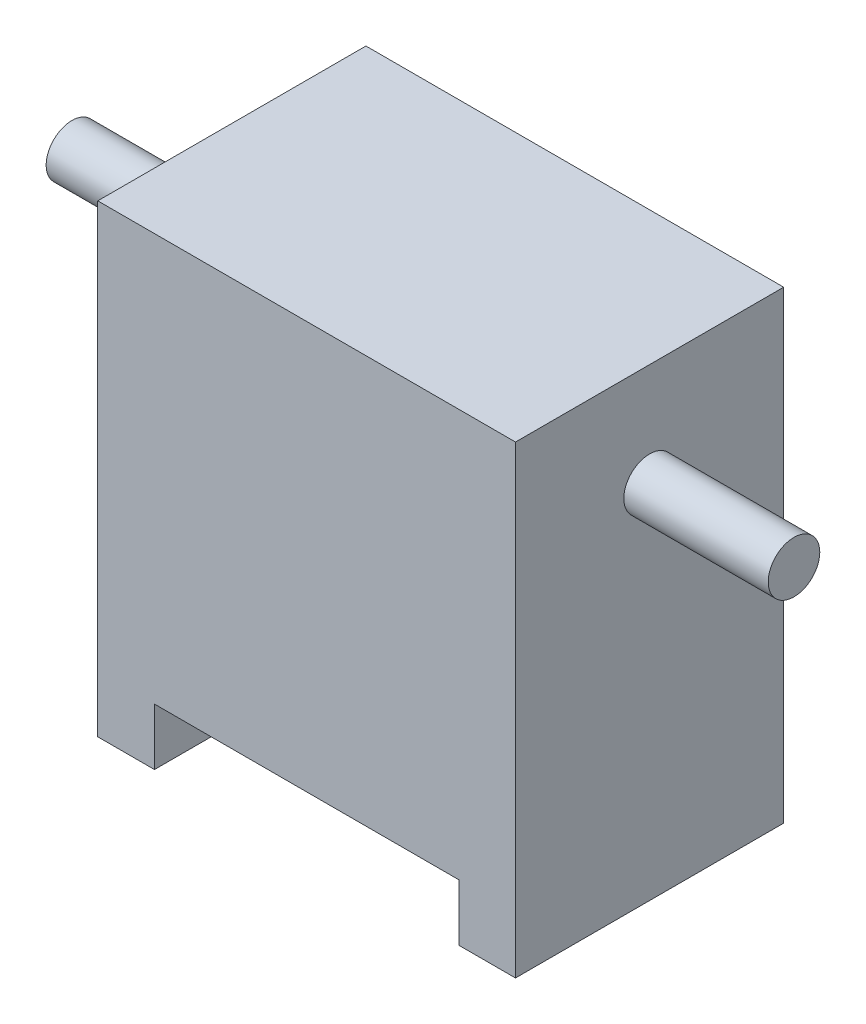
ISO-10303-21;
HEADER;
FILE_DESCRIPTION(('STEP AP214'),'2;1');
FILE_NAME('part.step','',(''),(''),'','','');
FILE_SCHEMA(('AUTOMOTIVE_DESIGN { 1 0 10303 214 1 1 1 1 }'));
ENDSEC;
DATA;
#1=APPLICATION_CONTEXT('core data for automotive mechanical design processes');
#2=APPLICATION_PROTOCOL_DEFINITION('international standard','automotive_design',2000,#1);
#3=PRODUCT_CONTEXT('',#1,'mechanical');
#4=PRODUCT('Part','Part','',(#3));
#5=PRODUCT_RELATED_PRODUCT_CATEGORY('part','',(#4));
#6=PRODUCT_DEFINITION_FORMATION('','',#4);
#7=PRODUCT_DEFINITION_CONTEXT('part definition',#1,'design');
#8=PRODUCT_DEFINITION('design','',#6,#7);
#9=PRODUCT_DEFINITION_SHAPE('','',#8);
#10=(LENGTH_UNIT() NAMED_UNIT(*) SI_UNIT(.MILLI.,.METRE.));
#11=(NAMED_UNIT(*) PLANE_ANGLE_UNIT() SI_UNIT($,.RADIAN.));
#12=(NAMED_UNIT(*) SI_UNIT($,.STERADIAN.) SOLID_ANGLE_UNIT());
#13=UNCERTAINTY_MEASURE_WITH_UNIT(LENGTH_MEASURE(1.E-05),#10,'distance_accuracy_value','');
#14=(GEOMETRIC_REPRESENTATION_CONTEXT(3) GLOBAL_UNCERTAINTY_ASSIGNED_CONTEXT((#13)) GLOBAL_UNIT_ASSIGNED_CONTEXT((#10,
#11,#12)) REPRESENTATION_CONTEXT('',''));
#15=CARTESIAN_POINT('',(0.,0.,0.));
#16=DIRECTION('',(0.,0.,1.));
#17=DIRECTION('',(1.,0.,0.));
#18=AXIS2_PLACEMENT_3D('',#15,#16,#17);
#19=CARTESIAN_POINT('',(0.,-45.,26.));
#20=DIRECTION('',(0.,1.,0.));
#21=DIRECTION('',(0.,0.,1.));
#22=AXIS2_PLACEMENT_3D('',#19,#20,#21);
#23=PLANE('',#22);
#24=DIRECTION('',(1.,0.,0.));
#25=VECTOR('',#24,1.);
#26=CARTESIAN_POINT('',(0.,-45.,26.));
#27=LINE('',#26,#25);
#28=CARTESIAN_POINT('',(35.,-45.,26.));
#29=VERTEX_POINT('',#28);
#30=CARTESIAN_POINT('',(40.5,-45.,26.));
#31=VERTEX_POINT('',#30);
#32=EDGE_CURVE('E153',#29,#31,#27,.T.);
#33=ORIENTED_EDGE('',*,*,#32,.F.);
#34=DIRECTION('',(0.,0.,1.));
#35=VECTOR('',#34,1.);
#36=CARTESIAN_POINT('',(35.,-45.,-12.));
#37=LINE('',#36,#35);
#38=CARTESIAN_POINT('',(35.,-45.,0.));
#39=VERTEX_POINT('',#38);
#40=EDGE_CURVE('E145',#39,#29,#37,.T.);
#41=ORIENTED_EDGE('',*,*,#40,.F.);
#42=DIRECTION('',(1.,0.,0.));
#43=VECTOR('',#42,1.);
#44=CARTESIAN_POINT('',(0.,-45.,0.));
#45=LINE('',#44,#43);
#46=CARTESIAN_POINT('',(40.5,-45.,0.));
#47=VERTEX_POINT('',#46);
#48=EDGE_CURVE('E165',#39,#47,#45,.T.);
#49=ORIENTED_EDGE('',*,*,#48,.T.);
#50=DIRECTION('',(0.,0.,-1.));
#51=VECTOR('',#50,1.);
#52=CARTESIAN_POINT('',(40.5,-45.,26.));
#53=LINE('',#52,#51);
#54=EDGE_CURVE('E180',#31,#47,#53,.T.);
#55=ORIENTED_EDGE('',*,*,#54,.F.);
#56=EDGE_LOOP('',(#33,#41,#49,#55));
#57=FACE_BOUND('',#56,.T.);
#58=ADVANCED_FACE('F39',(#57),#23,.F.);
#59=CARTESIAN_POINT('',(0.,0.,26.));
#60=DIRECTION('',(1.,0.,0.));
#61=DIRECTION('',(0.,1.,0.));
#62=AXIS2_PLACEMENT_3D('',#59,#60,#61);
#63=PLANE('',#62);
#64=CARTESIAN_POINT('',(0.,-10.,13.));
#65=DIRECTION('',(1.,0.,0.));
#66=DIRECTION('',(0.,1.,0.));
#67=AXIS2_PLACEMENT_3D('',#64,#65,#66);
#68=CIRCLE('',#67,2.5);
#69=CARTESIAN_POINT('',(0.,-7.5,13.));
#70=VERTEX_POINT('',#69);
#71=EDGE_CURVE('E133',#70,#70,#68,.T.);
#72=ORIENTED_EDGE('',*,*,#71,.T.);
#73=EDGE_LOOP('',(#72));
#74=FACE_BOUND('',#73,.T.);
#75=DIRECTION('',(0.,-1.,0.));
#76=VECTOR('',#75,1.);
#77=CARTESIAN_POINT('',(0.,0.,0.));
#78=LINE('',#77,#76);
#79=CARTESIAN_POINT('',(0.,0.,0.));
#80=VERTEX_POINT('',#79);
#81=CARTESIAN_POINT('',(0.,-45.,0.));
#82=VERTEX_POINT('',#81);
#83=EDGE_CURVE('E144',#80,#82,#78,.T.);
#84=ORIENTED_EDGE('',*,*,#83,.T.);
#85=DIRECTION('',(0.,0.,-1.));
#86=VECTOR('',#85,1.);
#87=CARTESIAN_POINT('',(0.,-45.,26.));
#88=LINE('',#87,#86);
#89=CARTESIAN_POINT('',(0.,-45.,26.));
#90=VERTEX_POINT('',#89);
#91=EDGE_CURVE('E184',#90,#82,#88,.T.);
#92=ORIENTED_EDGE('',*,*,#91,.F.);
#93=DIRECTION('',(0.,-1.,0.));
#94=VECTOR('',#93,1.);
#95=CARTESIAN_POINT('',(0.,0.,26.));
#96=LINE('',#95,#94);
#97=CARTESIAN_POINT('',(0.,0.,26.));
#98=VERTEX_POINT('',#97);
#99=EDGE_CURVE('E150',#98,#90,#96,.T.);
#100=ORIENTED_EDGE('',*,*,#99,.F.);
#101=DIRECTION('',(0.,0.,-1.));
#102=VECTOR('',#101,1.);
#103=CARTESIAN_POINT('',(0.,0.,26.));
#104=LINE('',#103,#102);
#105=EDGE_CURVE('E161',#98,#80,#104,.T.);
#106=ORIENTED_EDGE('',*,*,#105,.T.);
#107=EDGE_LOOP('',(#84,#92,#100,#106));
#108=FACE_BOUND('',#107,.T.);
#109=ADVANCED_FACE('F41',(#74,#108),#63,.F.);
#110=CARTESIAN_POINT('',(5.50000000000001,-45.,0.));
#111=VERTEX_POINT('',#110);
#112=EDGE_CURVE('E166',#82,#111,#45,.T.);
#113=ORIENTED_EDGE('',*,*,#112,.T.);
#114=DIRECTION('',(0.,0.,1.));
#115=VECTOR('',#114,1.);
#116=CARTESIAN_POINT('',(5.50000000000001,-45.,-12.));
#117=LINE('',#116,#115);
#118=CARTESIAN_POINT('',(5.50000000000001,-45.,26.));
#119=VERTEX_POINT('',#118);
#120=EDGE_CURVE('E56',#111,#119,#117,.T.);
#121=ORIENTED_EDGE('',*,*,#120,.T.);
#122=EDGE_CURVE('E93',#90,#119,#27,.T.);
#123=ORIENTED_EDGE('',*,*,#122,.F.);
#124=ORIENTED_EDGE('',*,*,#91,.T.);
#125=EDGE_LOOP('',(#113,#121,#123,#124));
#126=FACE_BOUND('',#125,.T.);
#127=ADVANCED_FACE('F218',(#126),#23,.F.);
#128=CARTESIAN_POINT('',(40.5,0.,26.));
#129=DIRECTION('',(-1.,0.,0.));
#130=DIRECTION('',(0.,0.,1.));
#131=AXIS2_PLACEMENT_3D('',#128,#129,#130);
#132=PLANE('',#131);
#133=CARTESIAN_POINT('',(40.5,-10.,13.));
#134=DIRECTION('',(-1.,0.,0.));
#135=DIRECTION('',(0.,0.,1.));
#136=AXIS2_PLACEMENT_3D('',#133,#134,#135);
#137=CIRCLE('',#136,2.5);
#138=CARTESIAN_POINT('',(40.5,-10.,15.5));
#139=VERTEX_POINT('',#138);
#140=EDGE_CURVE('E43',#139,#139,#137,.T.);
#141=ORIENTED_EDGE('',*,*,#140,.T.);
#142=EDGE_LOOP('',(#141));
#143=FACE_BOUND('',#142,.T.);
#144=DIRECTION('',(0.,1.,0.));
#145=VECTOR('',#144,1.);
#146=CARTESIAN_POINT('',(40.5,0.,0.));
#147=LINE('',#146,#145);
#148=CARTESIAN_POINT('',(40.5,0.,0.));
#149=VERTEX_POINT('',#148);
#150=EDGE_CURVE('E170',#47,#149,#147,.T.);
#151=ORIENTED_EDGE('',*,*,#150,.T.);
#152=DIRECTION('',(0.,0.,-1.));
#153=VECTOR('',#152,1.);
#154=CARTESIAN_POINT('',(40.5,0.,26.));
#155=LINE('',#154,#153);
#156=CARTESIAN_POINT('',(40.5,0.,26.));
#157=VERTEX_POINT('',#156);
#158=EDGE_CURVE('E177',#157,#149,#155,.T.);
#159=ORIENTED_EDGE('',*,*,#158,.F.);
#160=DIRECTION('',(0.,1.,0.));
#161=VECTOR('',#160,1.);
#162=CARTESIAN_POINT('',(40.5,0.,26.));
#163=LINE('',#162,#161);
#164=EDGE_CURVE('E156',#31,#157,#163,.T.);
#165=ORIENTED_EDGE('',*,*,#164,.F.);
#166=ORIENTED_EDGE('',*,*,#54,.T.);
#167=EDGE_LOOP('',(#151,#159,#165,#166));
#168=FACE_BOUND('',#167,.T.);
#169=ADVANCED_FACE('F204',(#143,#168),#132,.F.);
#170=CARTESIAN_POINT('',(0.,0.,26.));
#171=DIRECTION('',(0.,-1.,0.));
#172=DIRECTION('',(0.,0.,-1.));
#173=AXIS2_PLACEMENT_3D('',#170,#171,#172);
#174=PLANE('',#173);
#175=DIRECTION('',(-1.,0.,0.));
#176=VECTOR('',#175,1.);
#177=CARTESIAN_POINT('',(0.,0.,0.));
#178=LINE('',#177,#176);
#179=EDGE_CURVE('E86',#149,#80,#178,.T.);
#180=ORIENTED_EDGE('',*,*,#179,.T.);
#181=ORIENTED_EDGE('',*,*,#105,.F.);
#182=DIRECTION('',(-1.,0.,0.));
#183=VECTOR('',#182,1.);
#184=CARTESIAN_POINT('',(0.,0.,26.));
#185=LINE('',#184,#183);
#186=EDGE_CURVE('E65',#157,#98,#185,.T.);
#187=ORIENTED_EDGE('',*,*,#186,.F.);
#188=ORIENTED_EDGE('',*,*,#158,.T.);
#189=EDGE_LOOP('',(#180,#181,#187,#188));
#190=FACE_BOUND('',#189,.T.);
#191=ADVANCED_FACE('F210',(#190),#174,.F.);
#192=CARTESIAN_POINT('',(0.,0.,26.));
#193=DIRECTION('',(0.,0.,1.));
#194=DIRECTION('',(1.,0.,0.));
#195=AXIS2_PLACEMENT_3D('',#192,#193,#194);
#196=PLANE('',#195);
#197=DIRECTION('',(0.,1.,0.));
#198=VECTOR('',#197,1.);
#199=CARTESIAN_POINT('',(35.,-39.5,26.));
#200=LINE('',#199,#198);
#201=CARTESIAN_POINT('',(35.,-39.5,26.));
#202=VERTEX_POINT('',#201);
#203=EDGE_CURVE('E123',#29,#202,#200,.T.);
#204=ORIENTED_EDGE('',*,*,#203,.F.);
#205=ORIENTED_EDGE('',*,*,#32,.T.);
#206=ORIENTED_EDGE('',*,*,#164,.T.);
#207=ORIENTED_EDGE('',*,*,#186,.T.);
#208=ORIENTED_EDGE('',*,*,#99,.T.);
#209=ORIENTED_EDGE('',*,*,#122,.T.);
#210=DIRECTION('',(0.,-1.,0.));
#211=VECTOR('',#210,1.);
#212=CARTESIAN_POINT('',(5.50000000000001,-39.5,26.));
#213=LINE('',#212,#211);
#214=CARTESIAN_POINT('',(5.50000000000001,-39.5,26.));
#215=VERTEX_POINT('',#214);
#216=EDGE_CURVE('E118',#215,#119,#213,.T.);
#217=ORIENTED_EDGE('',*,*,#216,.F.);
#218=DIRECTION('',(-1.,0.,0.));
#219=VECTOR('',#218,1.);
#220=CARTESIAN_POINT('',(5.50000000000001,-39.5,26.));
#221=LINE('',#220,#219);
#222=EDGE_CURVE('E126',#202,#215,#221,.T.);
#223=ORIENTED_EDGE('',*,*,#222,.F.);
#224=EDGE_LOOP('',(#204,#205,#206,#207,#208,#209,#217,#223));
#225=FACE_BOUND('',#224,.T.);
#226=ADVANCED_FACE('F135',(#225),#196,.T.);
#227=CARTESIAN_POINT('',(0.,0.,0.));
#228=DIRECTION('',(0.,0.,1.));
#229=DIRECTION('',(1.,0.,0.));
#230=AXIS2_PLACEMENT_3D('',#227,#228,#229);
#231=PLANE('',#230);
#232=ORIENTED_EDGE('',*,*,#48,.F.);
#233=DIRECTION('',(0.,1.,0.));
#234=VECTOR('',#233,1.);
#235=CARTESIAN_POINT('',(35.,0.,0.));
#236=LINE('',#235,#234);
#237=CARTESIAN_POINT('',(35.,-39.5,0.));
#238=VERTEX_POINT('',#237);
#239=EDGE_CURVE('E11',#39,#238,#236,.T.);
#240=ORIENTED_EDGE('',*,*,#239,.T.);
#241=DIRECTION('',(-1.,0.,0.));
#242=VECTOR('',#241,1.);
#243=CARTESIAN_POINT('',(0.,-39.5,0.));
#244=LINE('',#243,#242);
#245=CARTESIAN_POINT('',(5.50000000000001,-39.5,0.));
#246=VERTEX_POINT('',#245);
#247=EDGE_CURVE('E49',#238,#246,#244,.T.);
#248=ORIENTED_EDGE('',*,*,#247,.T.);
#249=DIRECTION('',(0.,-1.,0.));
#250=VECTOR('',#249,1.);
#251=CARTESIAN_POINT('',(5.5,0.,0.));
#252=LINE('',#251,#250);
#253=EDGE_CURVE('E119',#246,#111,#252,.T.);
#254=ORIENTED_EDGE('',*,*,#253,.T.);
#255=ORIENTED_EDGE('',*,*,#112,.F.);
#256=ORIENTED_EDGE('',*,*,#83,.F.);
#257=ORIENTED_EDGE('',*,*,#179,.F.);
#258=ORIENTED_EDGE('',*,*,#150,.F.);
#259=EDGE_LOOP('',(#232,#240,#248,#254,#255,#256,#257,#258));
#260=FACE_BOUND('',#259,.T.);
#261=ADVANCED_FACE('F192',(#260),#231,.F.);
#262=CARTESIAN_POINT('',(5.50000000000001,-39.5,-12.));
#263=DIRECTION('',(0.,1.,0.));
#264=DIRECTION('',(0.,0.,1.));
#265=AXIS2_PLACEMENT_3D('',#262,#263,#264);
#266=PLANE('',#265);
#267=DIRECTION('',(0.,0.,1.));
#268=VECTOR('',#267,1.);
#269=CARTESIAN_POINT('',(35.,-39.5,-12.));
#270=LINE('',#269,#268);
#271=EDGE_CURVE('E129',#238,#202,#270,.T.);
#272=ORIENTED_EDGE('',*,*,#271,.T.);
#273=ORIENTED_EDGE('',*,*,#222,.T.);
#274=DIRECTION('',(0.,0.,1.));
#275=VECTOR('',#274,1.);
#276=CARTESIAN_POINT('',(5.50000000000001,-39.5,-12.));
#277=LINE('',#276,#275);
#278=EDGE_CURVE('E114',#246,#215,#277,.T.);
#279=ORIENTED_EDGE('',*,*,#278,.F.);
#280=ORIENTED_EDGE('',*,*,#247,.F.);
#281=EDGE_LOOP('',(#272,#273,#279,#280));
#282=FACE_BOUND('',#281,.T.);
#283=ADVANCED_FACE('F127',(#282),#266,.F.);
#284=CARTESIAN_POINT('',(35.,-39.5,-12.));
#285=DIRECTION('',(1.,0.,0.));
#286=DIRECTION('',(0.,0.,-1.));
#287=AXIS2_PLACEMENT_3D('',#284,#285,#286);
#288=PLANE('',#287);
#289=ORIENTED_EDGE('',*,*,#40,.T.);
#290=ORIENTED_EDGE('',*,*,#203,.T.);
#291=ORIENTED_EDGE('',*,*,#271,.F.);
#292=ORIENTED_EDGE('',*,*,#239,.F.);
#293=EDGE_LOOP('',(#289,#290,#291,#292));
#294=FACE_BOUND('',#293,.T.);
#295=ADVANCED_FACE('F194',(#294),#288,.F.);
#296=CARTESIAN_POINT('',(5.50000000000001,-39.5,-12.));
#297=DIRECTION('',(-1.,0.,0.));
#298=DIRECTION('',(0.,-1.,0.));
#299=AXIS2_PLACEMENT_3D('',#296,#297,#298);
#300=PLANE('',#299);
#301=ORIENTED_EDGE('',*,*,#278,.T.);
#302=ORIENTED_EDGE('',*,*,#216,.T.);
#303=ORIENTED_EDGE('',*,*,#120,.F.);
#304=ORIENTED_EDGE('',*,*,#253,.F.);
#305=EDGE_LOOP('',(#301,#302,#303,#304));
#306=FACE_BOUND('',#305,.T.);
#307=ADVANCED_FACE('F116',(#306),#300,.F.);
#308=CARTESIAN_POINT('',(54.5,-10.,13.));
#309=DIRECTION('',(1.,0.,0.));
#310=DIRECTION('',(0.,0.,-1.));
#311=AXIS2_PLACEMENT_3D('',#308,#309,#310);
#312=PLANE('',#311);
#313=CARTESIAN_POINT('',(54.5,-10.,13.));
#314=DIRECTION('',(1.,0.,0.));
#315=DIRECTION('',(0.,0.,-1.));
#316=AXIS2_PLACEMENT_3D('',#313,#314,#315);
#317=CIRCLE('',#316,2.5);
#318=CARTESIAN_POINT('',(54.5,-10.,10.5));
#319=VERTEX_POINT('',#318);
#320=EDGE_CURVE('E330',#319,#319,#317,.T.);
#321=ORIENTED_EDGE('',*,*,#320,.T.);
#322=EDGE_LOOP('',(#321));
#323=FACE_BOUND('',#322,.T.);
#324=ADVANCED_FACE('F246',(#323),#312,.T.);
#325=CARTESIAN_POINT('',(-15.5,-10.,13.));
#326=DIRECTION('',(1.,0.,0.));
#327=DIRECTION('',(0.,0.,-1.));
#328=AXIS2_PLACEMENT_3D('',#325,#326,#327);
#329=CYLINDRICAL_SURFACE('',#328,2.5);
#330=ORIENTED_EDGE('',*,*,#320,.F.);
#331=EDGE_LOOP('',(#330));
#332=FACE_BOUND('',#331,.T.);
#333=ORIENTED_EDGE('',*,*,#140,.F.);
#334=EDGE_LOOP('',(#333));
#335=FACE_BOUND('',#334,.T.);
#336=ADVANCED_FACE('F251',(#332,#335),#329,.T.);
#337=CARTESIAN_POINT('',(-15.5,-10.,13.));
#338=DIRECTION('',(1.,0.,0.));
#339=DIRECTION('',(0.,0.,-1.));
#340=AXIS2_PLACEMENT_3D('',#337,#338,#339);
#341=CIRCLE('',#340,2.5);
#342=CARTESIAN_POINT('',(-15.5,-10.,10.5));
#343=VERTEX_POINT('',#342);
#344=EDGE_CURVE('E328',#343,#343,#341,.T.);
#345=ORIENTED_EDGE('',*,*,#344,.T.);
#346=EDGE_LOOP('',(#345));
#347=FACE_BOUND('',#346,.T.);
#348=ORIENTED_EDGE('',*,*,#71,.F.);
#349=EDGE_LOOP('',(#348));
#350=FACE_BOUND('',#349,.T.);
#351=ADVANCED_FACE('F263',(#347,#350),#329,.T.);
#352=CARTESIAN_POINT('',(-15.5,-10.,13.));
#353=DIRECTION('',(1.,0.,0.));
#354=DIRECTION('',(0.,0.,-1.));
#355=AXIS2_PLACEMENT_3D('',#352,#353,#354);
#356=PLANE('',#355);
#357=ORIENTED_EDGE('',*,*,#344,.F.);
#358=EDGE_LOOP('',(#357));
#359=FACE_BOUND('',#358,.T.);
#360=ADVANCED_FACE('F273',(#359),#356,.F.);
#361=CLOSED_SHELL('',(#58,#109,#127,#169,#191,#226,#261,#283,#295,#307,#324,#336,#351,#360));
#362=MANIFOLD_SOLID_BREP('B2',#361);
#363=ADVANCED_BREP_SHAPE_REPRESENTATION('',(#18,#362),#14);
#364=SHAPE_DEFINITION_REPRESENTATION(#9,#363);
ENDSEC;
END-ISO-10303-21;
